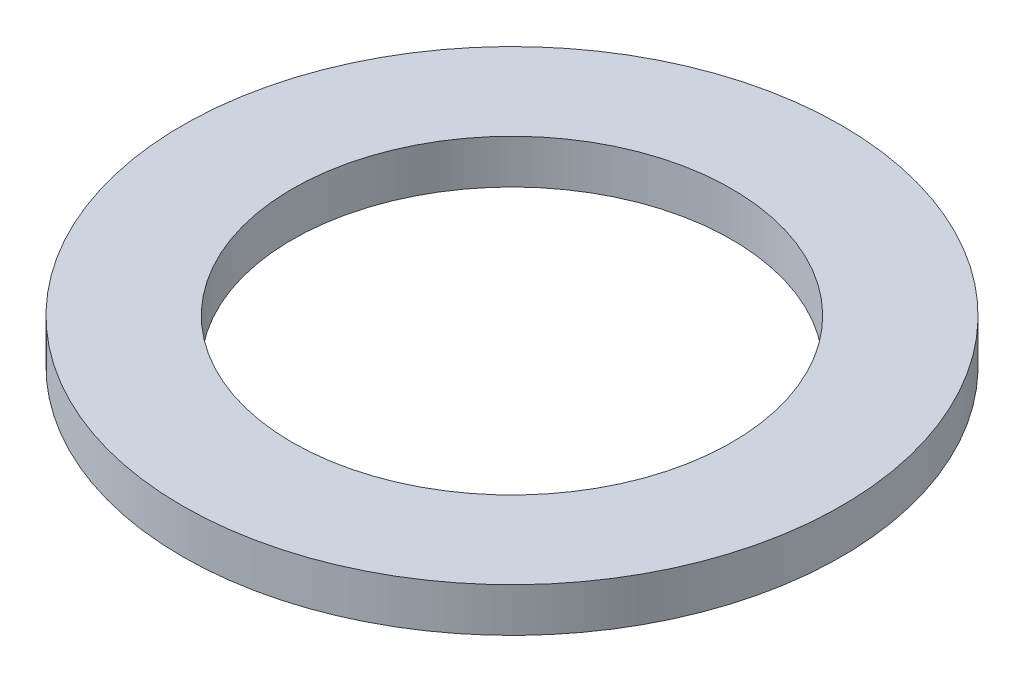
ISO-10303-21;
HEADER;
FILE_DESCRIPTION(('STEP AP214'),'2;1');
FILE_NAME('part.step','',(''),(''),'','','');
FILE_SCHEMA(('AUTOMOTIVE_DESIGN { 1 0 10303 214 1 1 1 1 }'));
ENDSEC;
DATA;
#1=APPLICATION_CONTEXT('core data for automotive mechanical design processes');
#2=APPLICATION_PROTOCOL_DEFINITION('international standard','automotive_design',2000,#1);
#3=PRODUCT_CONTEXT('',#1,'mechanical');
#4=PRODUCT('Part','Part','',(#3));
#5=PRODUCT_RELATED_PRODUCT_CATEGORY('part','',(#4));
#6=PRODUCT_DEFINITION_FORMATION('','',#4);
#7=PRODUCT_DEFINITION_CONTEXT('part definition',#1,'design');
#8=PRODUCT_DEFINITION('design','',#6,#7);
#9=PRODUCT_DEFINITION_SHAPE('','',#8);
#10=(LENGTH_UNIT() NAMED_UNIT(*) SI_UNIT(.MILLI.,.METRE.));
#11=(NAMED_UNIT(*) PLANE_ANGLE_UNIT() SI_UNIT($,.RADIAN.));
#12=(NAMED_UNIT(*) SI_UNIT($,.STERADIAN.) SOLID_ANGLE_UNIT());
#13=UNCERTAINTY_MEASURE_WITH_UNIT(LENGTH_MEASURE(1.E-05),#10,'distance_accuracy_value','');
#14=(GEOMETRIC_REPRESENTATION_CONTEXT(3) GLOBAL_UNCERTAINTY_ASSIGNED_CONTEXT((#13)) GLOBAL_UNIT_ASSIGNED_CONTEXT((#10,
#11,#12)) REPRESENTATION_CONTEXT('',''));
#15=CARTESIAN_POINT('',(0.,0.,0.));
#16=DIRECTION('',(0.,0.,1.));
#17=DIRECTION('',(1.,0.,0.));
#18=AXIS2_PLACEMENT_3D('',#15,#16,#17);
#19=CARTESIAN_POINT('',(0.,-0.317499999999999,0.));
#20=DIRECTION('',(0.,1.,0.));
#21=DIRECTION('',(0.,0.,1.));
#22=AXIS2_PLACEMENT_3D('',#19,#20,#21);
#23=CYLINDRICAL_SURFACE('',#22,4.7625);
#24=CARTESIAN_POINT('',(0.,-0.317499999999999,0.));
#25=DIRECTION('',(0.,1.,0.));
#26=DIRECTION('',(0.,0.,1.));
#27=AXIS2_PLACEMENT_3D('',#24,#25,#26);
#28=CIRCLE('',#27,4.7625);
#29=CARTESIAN_POINT('',(0.,-0.317499999999999,4.7625));
#30=VERTEX_POINT('',#29);
#31=EDGE_CURVE('E10',#30,#30,#28,.T.);
#32=ORIENTED_EDGE('',*,*,#31,.T.);
#33=EDGE_LOOP('',(#32));
#34=FACE_BOUND('',#33,.T.);
#35=CARTESIAN_POINT('',(0.,0.317500000000001,0.));
#36=DIRECTION('',(0.,1.,0.));
#37=DIRECTION('',(0.,0.,1.));
#38=AXIS2_PLACEMENT_3D('',#35,#36,#37);
#39=CIRCLE('',#38,4.7625);
#40=CARTESIAN_POINT('',(0.,0.317500000000001,4.7625));
#41=VERTEX_POINT('',#40);
#42=EDGE_CURVE('E42',#41,#41,#39,.T.);
#43=ORIENTED_EDGE('',*,*,#42,.F.);
#44=EDGE_LOOP('',(#43));
#45=FACE_BOUND('',#44,.T.);
#46=ADVANCED_FACE('F32',(#34,#45),#23,.T.);
#47=CARTESIAN_POINT('',(0.,-0.317499999999999,0.));
#48=DIRECTION('',(0.,1.,0.));
#49=DIRECTION('',(0.,0.,1.));
#50=AXIS2_PLACEMENT_3D('',#47,#48,#49);
#51=PLANE('',#50);
#52=CARTESIAN_POINT('',(0.,-0.317499999999999,0.));
#53=DIRECTION('',(0.,1.,0.));
#54=DIRECTION('',(0.,0.,1.));
#55=AXIS2_PLACEMENT_3D('',#52,#53,#54);
#56=CIRCLE('',#55,3.175);
#57=CARTESIAN_POINT('',(0.,-0.317499999999999,3.175));
#58=VERTEX_POINT('',#57);
#59=EDGE_CURVE('E38',#58,#58,#56,.T.);
#60=ORIENTED_EDGE('',*,*,#59,.T.);
#61=EDGE_LOOP('',(#60));
#62=FACE_BOUND('',#61,.T.);
#63=ORIENTED_EDGE('',*,*,#31,.F.);
#64=EDGE_LOOP('',(#63));
#65=FACE_BOUND('',#64,.T.);
#66=ADVANCED_FACE('F61',(#62,#65),#51,.F.);
#67=CARTESIAN_POINT('',(0.,-0.317499999999999,0.));
#68=DIRECTION('',(0.,1.,0.));
#69=DIRECTION('',(0.,0.,1.));
#70=AXIS2_PLACEMENT_3D('',#67,#68,#69);
#71=CYLINDRICAL_SURFACE('',#70,3.175);
#72=ORIENTED_EDGE('',*,*,#59,.F.);
#73=EDGE_LOOP('',(#72));
#74=FACE_BOUND('',#73,.T.);
#75=CARTESIAN_POINT('',(0.,0.317500000000001,0.));
#76=DIRECTION('',(0.,1.,0.));
#77=DIRECTION('',(0.,0.,1.));
#78=AXIS2_PLACEMENT_3D('',#75,#76,#77);
#79=CIRCLE('',#78,3.175);
#80=CARTESIAN_POINT('',(0.,0.317500000000001,3.175));
#81=VERTEX_POINT('',#80);
#82=EDGE_CURVE('E46',#81,#81,#79,.T.);
#83=ORIENTED_EDGE('',*,*,#82,.T.);
#84=EDGE_LOOP('',(#83));
#85=FACE_BOUND('',#84,.T.);
#86=ADVANCED_FACE('F52',(#74,#85),#71,.F.);
#87=CARTESIAN_POINT('',(0.,0.317500000000001,0.));
#88=DIRECTION('',(0.,1.,0.));
#89=DIRECTION('',(0.,0.,1.));
#90=AXIS2_PLACEMENT_3D('',#87,#88,#89);
#91=PLANE('',#90);
#92=ORIENTED_EDGE('',*,*,#42,.T.);
#93=EDGE_LOOP('',(#92));
#94=FACE_BOUND('',#93,.T.);
#95=ORIENTED_EDGE('',*,*,#82,.F.);
#96=EDGE_LOOP('',(#95));
#97=FACE_BOUND('',#96,.T.);
#98=ADVANCED_FACE('F54',(#94,#97),#91,.T.);
#99=CLOSED_SHELL('',(#46,#66,#86,#98));
#100=MANIFOLD_SOLID_BREP('B2',#99);
#101=ADVANCED_BREP_SHAPE_REPRESENTATION('',(#18,#100),#14);
#102=SHAPE_DEFINITION_REPRESENTATION(#9,#101);
ENDSEC;
END-ISO-10303-21;
